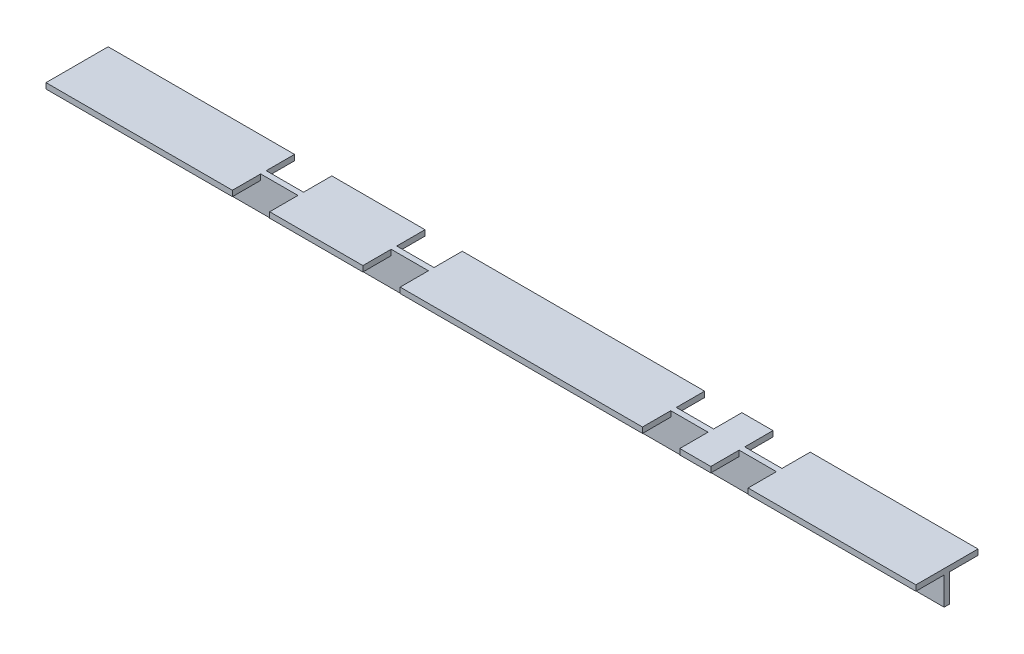
ISO-10303-21;
HEADER;
FILE_DESCRIPTION(('STEP AP214'),'2;1');
FILE_NAME('part.step','',(''),(''),'','','');
FILE_SCHEMA(('AUTOMOTIVE_DESIGN { 1 0 10303 214 1 1 1 1 }'));
ENDSEC;
DATA;
#1=APPLICATION_CONTEXT('core data for automotive mechanical design processes');
#2=APPLICATION_PROTOCOL_DEFINITION('international standard','automotive_design',2000,#1);
#3=PRODUCT_CONTEXT('',#1,'mechanical');
#4=PRODUCT('Part','Part','',(#3));
#5=PRODUCT_RELATED_PRODUCT_CATEGORY('part','',(#4));
#6=PRODUCT_DEFINITION_FORMATION('','',#4);
#7=PRODUCT_DEFINITION_CONTEXT('part definition',#1,'design');
#8=PRODUCT_DEFINITION('design','',#6,#7);
#9=PRODUCT_DEFINITION_SHAPE('','',#8);
#10=(LENGTH_UNIT() NAMED_UNIT(*) SI_UNIT(.MILLI.,.METRE.));
#11=(NAMED_UNIT(*) PLANE_ANGLE_UNIT() SI_UNIT($,.RADIAN.));
#12=(NAMED_UNIT(*) SI_UNIT($,.STERADIAN.) SOLID_ANGLE_UNIT());
#13=UNCERTAINTY_MEASURE_WITH_UNIT(LENGTH_MEASURE(1.E-05),#10,'distance_accuracy_value','');
#14=(GEOMETRIC_REPRESENTATION_CONTEXT(3) GLOBAL_UNCERTAINTY_ASSIGNED_CONTEXT((#13)) GLOBAL_UNIT_ASSIGNED_CONTEXT((#10,
#11,#12)) REPRESENTATION_CONTEXT('',''));
#15=CARTESIAN_POINT('',(0.,0.,0.));
#16=DIRECTION('',(0.,0.,1.));
#17=DIRECTION('',(1.,0.,0.));
#18=AXIS2_PLACEMENT_3D('',#15,#16,#17);
#19=CARTESIAN_POINT('',(1400.,0.,0.));
#20=DIRECTION('',(0.,0.,-1.));
#21=DIRECTION('',(-1.,0.,0.));
#22=AXIS2_PLACEMENT_3D('',#19,#20,#21);
#23=PLANE('',#22);
#24=DIRECTION('',(-1.,0.,0.));
#25=VECTOR('',#24,1.);
#26=CARTESIAN_POINT('',(1400.,0.,0.));
#27=LINE('',#26,#25);
#28=CARTESIAN_POINT('',(960.,0.,0.));
#29=VERTEX_POINT('',#28);
#30=CARTESIAN_POINT('',(570.,0.,0.));
#31=VERTEX_POINT('',#30);
#32=EDGE_CURVE('E686',#29,#31,#27,.T.);
#33=ORIENTED_EDGE('',*,*,#32,.T.);
#34=DIRECTION('',(0.,-1.,0.));
#35=VECTOR('',#34,1.);
#36=CARTESIAN_POINT('',(570.,0.,0.));
#37=LINE('',#36,#35);
#38=CARTESIAN_POINT('',(570.,-9.,0.));
#39=VERTEX_POINT('',#38);
#40=EDGE_CURVE('E422',#31,#39,#37,.T.);
#41=ORIENTED_EDGE('',*,*,#40,.T.);
#42=DIRECTION('',(-1.,0.,0.));
#43=VECTOR('',#42,1.);
#44=CARTESIAN_POINT('',(1400.,-9.,0.));
#45=LINE('',#44,#43);
#46=CARTESIAN_POINT('',(960.,-9.,0.));
#47=VERTEX_POINT('',#46);
#48=EDGE_CURVE('E679',#47,#39,#45,.T.);
#49=ORIENTED_EDGE('',*,*,#48,.F.);
#50=DIRECTION('',(0.,-1.,0.));
#51=VECTOR('',#50,1.);
#52=CARTESIAN_POINT('',(960.,0.,0.));
#53=LINE('',#52,#51);
#54=EDGE_CURVE('E405',#29,#47,#53,.T.);
#55=ORIENTED_EDGE('',*,*,#54,.F.);
#56=EDGE_LOOP('',(#33,#41,#49,#55));
#57=FACE_BOUND('',#56,.T.);
#58=ADVANCED_FACE('F40',(#57),#23,.F.);
#59=CARTESIAN_POINT('',(1400.,0.,0.));
#60=VERTEX_POINT('',#59);
#61=CARTESIAN_POINT('',(1130.,0.,0.));
#62=VERTEX_POINT('',#61);
#63=EDGE_CURVE('E620',#60,#62,#27,.T.);
#64=ORIENTED_EDGE('',*,*,#63,.T.);
#65=DIRECTION('',(0.,-1.,0.));
#66=VECTOR('',#65,1.);
#67=CARTESIAN_POINT('',(1130.,0.,0.));
#68=LINE('',#67,#66);
#69=CARTESIAN_POINT('',(1130.,-9.,0.));
#70=VERTEX_POINT('',#69);
#71=EDGE_CURVE('E454',#62,#70,#68,.T.);
#72=ORIENTED_EDGE('',*,*,#71,.T.);
#73=CARTESIAN_POINT('',(1400.,-9.,0.));
#74=VERTEX_POINT('',#73);
#75=EDGE_CURVE('E11',#74,#70,#45,.T.);
#76=ORIENTED_EDGE('',*,*,#75,.F.);
#77=DIRECTION('',(0.,-1.,0.));
#78=VECTOR('',#77,1.);
#79=CARTESIAN_POINT('',(1400.,0.,0.));
#80=LINE('',#79,#78);
#81=EDGE_CURVE('E566',#60,#74,#80,.T.);
#82=ORIENTED_EDGE('',*,*,#81,.F.);
#83=EDGE_LOOP('',(#64,#72,#76,#82));
#84=FACE_BOUND('',#83,.T.);
#85=ADVANCED_FACE('F757',(#84),#23,.F.);
#86=CARTESIAN_POINT('',(1070.,-9.,0.));
#87=VERTEX_POINT('',#86);
#88=CARTESIAN_POINT('',(1020.,-9.,0.));
#89=VERTEX_POINT('',#88);
#90=EDGE_CURVE('E49',#87,#89,#45,.T.);
#91=ORIENTED_EDGE('',*,*,#90,.F.);
#92=DIRECTION('',(0.,-1.,0.));
#93=VECTOR('',#92,1.);
#94=CARTESIAN_POINT('',(1070.,0.,0.));
#95=LINE('',#94,#93);
#96=CARTESIAN_POINT('',(1070.,0.,0.));
#97=VERTEX_POINT('',#96);
#98=EDGE_CURVE('E467',#97,#87,#95,.T.);
#99=ORIENTED_EDGE('',*,*,#98,.F.);
#100=CARTESIAN_POINT('',(1020.,0.,0.));
#101=VERTEX_POINT('',#100);
#102=EDGE_CURVE('E625',#97,#101,#27,.T.);
#103=ORIENTED_EDGE('',*,*,#102,.T.);
#104=DIRECTION('',(0.,-1.,0.));
#105=VECTOR('',#104,1.);
#106=CARTESIAN_POINT('',(1020.,0.,0.));
#107=LINE('',#106,#105);
#108=EDGE_CURVE('E394',#101,#89,#107,.T.);
#109=ORIENTED_EDGE('',*,*,#108,.T.);
#110=EDGE_LOOP('',(#91,#99,#103,#109));
#111=FACE_BOUND('',#110,.T.);
#112=ADVANCED_FACE('F738',(#111),#23,.F.);
#113=CARTESIAN_POINT('',(510.,-9.,0.));
#114=VERTEX_POINT('',#113);
#115=CARTESIAN_POINT('',(360.,-9.,0.));
#116=VERTEX_POINT('',#115);
#117=EDGE_CURVE('E658',#114,#116,#45,.T.);
#118=ORIENTED_EDGE('',*,*,#117,.F.);
#119=DIRECTION('',(0.,-1.,0.));
#120=VECTOR('',#119,1.);
#121=CARTESIAN_POINT('',(510.,0.,0.));
#122=LINE('',#121,#120);
#123=CARTESIAN_POINT('',(510.,0.,0.));
#124=VERTEX_POINT('',#123);
#125=EDGE_CURVE('E437',#124,#114,#122,.T.);
#126=ORIENTED_EDGE('',*,*,#125,.F.);
#127=CARTESIAN_POINT('',(360.,0.,0.));
#128=VERTEX_POINT('',#127);
#129=EDGE_CURVE('E688',#124,#128,#27,.T.);
#130=ORIENTED_EDGE('',*,*,#129,.T.);
#131=DIRECTION('',(0.,-1.,0.));
#132=VECTOR('',#131,1.);
#133=CARTESIAN_POINT('',(360.,0.,0.));
#134=LINE('',#133,#132);
#135=EDGE_CURVE('E547',#128,#116,#134,.T.);
#136=ORIENTED_EDGE('',*,*,#135,.T.);
#137=EDGE_LOOP('',(#118,#126,#130,#136));
#138=FACE_BOUND('',#137,.T.);
#139=ADVANCED_FACE('F722',(#138),#23,.F.);
#140=CARTESIAN_POINT('',(1400.,-9.,0.));
#141=DIRECTION('',(0.,1.,0.));
#142=DIRECTION('',(0.,0.,1.));
#143=AXIS2_PLACEMENT_3D('',#140,#141,#142);
#144=PLANE('',#143);
#145=ORIENTED_EDGE('',*,*,#48,.T.);
#146=DIRECTION('',(0.,0.,1.));
#147=VECTOR('',#146,1.);
#148=CARTESIAN_POINT('',(570.,-8.99999999999998,-45.5));
#149=LINE('',#148,#147);
#150=CARTESIAN_POINT('',(570.,-8.99999999999998,-45.5));
#151=VERTEX_POINT('',#150);
#152=EDGE_CURVE('E423',#151,#39,#149,.T.);
#153=ORIENTED_EDGE('',*,*,#152,.F.);
#154=DIRECTION('',(-1.,0.,0.));
#155=VECTOR('',#154,1.);
#156=CARTESIAN_POINT('',(1400.,-8.99999999999998,-45.5));
#157=LINE('',#156,#155);
#158=CARTESIAN_POINT('',(960.,-8.99999999999998,-45.5));
#159=VERTEX_POINT('',#158);
#160=EDGE_CURVE('E660',#159,#151,#157,.T.);
#161=ORIENTED_EDGE('',*,*,#160,.F.);
#162=DIRECTION('',(0.,0.,-1.));
#163=VECTOR('',#162,1.);
#164=CARTESIAN_POINT('',(960.,-9.,0.));
#165=LINE('',#164,#163);
#166=EDGE_CURVE('E386',#47,#159,#165,.T.);
#167=ORIENTED_EDGE('',*,*,#166,.F.);
#168=EDGE_LOOP('',(#145,#153,#161,#167));
#169=FACE_BOUND('',#168,.T.);
#170=ADVANCED_FACE('F677',(#169),#144,.F.);
#171=ORIENTED_EDGE('',*,*,#75,.T.);
#172=DIRECTION('',(0.,0.,1.));
#173=VECTOR('',#172,1.);
#174=CARTESIAN_POINT('',(1130.,-8.99999999999998,-45.5));
#175=LINE('',#174,#173);
#176=CARTESIAN_POINT('',(1130.,-8.99999999999998,-45.5));
#177=VERTEX_POINT('',#176);
#178=EDGE_CURVE('E455',#177,#70,#175,.T.);
#179=ORIENTED_EDGE('',*,*,#178,.F.);
#180=CARTESIAN_POINT('',(1400.,-8.99999999999998,-45.5));
#181=VERTEX_POINT('',#180);
#182=EDGE_CURVE('E650',#181,#177,#157,.T.);
#183=ORIENTED_EDGE('',*,*,#182,.F.);
#184=DIRECTION('',(0.,0.,-1.));
#185=VECTOR('',#184,1.);
#186=CARTESIAN_POINT('',(1400.,-9.,0.));
#187=LINE('',#186,#185);
#188=EDGE_CURVE('E570',#74,#181,#187,.T.);
#189=ORIENTED_EDGE('',*,*,#188,.F.);
#190=EDGE_LOOP('',(#171,#179,#183,#189));
#191=FACE_BOUND('',#190,.T.);
#192=ADVANCED_FACE('F778',(#191),#144,.F.);
#193=CARTESIAN_POINT('',(1070.,-8.99999999999998,-45.5));
#194=VERTEX_POINT('',#193);
#195=CARTESIAN_POINT('',(1020.,-8.99999999999998,-45.5));
#196=VERTEX_POINT('',#195);
#197=EDGE_CURVE('E653',#194,#196,#157,.T.);
#198=ORIENTED_EDGE('',*,*,#197,.F.);
#199=DIRECTION('',(0.,0.,-1.));
#200=VECTOR('',#199,1.);
#201=CARTESIAN_POINT('',(1070.,-8.99999999999998,-45.5));
#202=LINE('',#201,#200);
#203=EDGE_CURVE('E448',#87,#194,#202,.T.);
#204=ORIENTED_EDGE('',*,*,#203,.F.);
#205=ORIENTED_EDGE('',*,*,#90,.T.);
#206=DIRECTION('',(0.,0.,1.));
#207=VECTOR('',#206,1.);
#208=CARTESIAN_POINT('',(1020.,-9.,0.));
#209=LINE('',#208,#207);
#210=EDGE_CURVE('E340',#196,#89,#209,.T.);
#211=ORIENTED_EDGE('',*,*,#210,.F.);
#212=EDGE_LOOP('',(#198,#204,#205,#211));
#213=FACE_BOUND('',#212,.T.);
#214=ADVANCED_FACE('F735',(#213),#144,.F.);
#215=CARTESIAN_POINT('',(510.,-8.99999999999998,-45.5));
#216=VERTEX_POINT('',#215);
#217=CARTESIAN_POINT('',(360.,-8.99999999999998,-45.5));
#218=VERTEX_POINT('',#217);
#219=EDGE_CURVE('E662',#216,#218,#157,.T.);
#220=ORIENTED_EDGE('',*,*,#219,.F.);
#221=DIRECTION('',(0.,0.,-1.));
#222=VECTOR('',#221,1.);
#223=CARTESIAN_POINT('',(510.,-8.99999999999998,-45.5));
#224=LINE('',#223,#222);
#225=EDGE_CURVE('E416',#114,#216,#224,.T.);
#226=ORIENTED_EDGE('',*,*,#225,.F.);
#227=ORIENTED_EDGE('',*,*,#117,.T.);
#228=DIRECTION('',(0.,0.,1.));
#229=VECTOR('',#228,1.);
#230=CARTESIAN_POINT('',(360.,-8.99999999999998,-45.5));
#231=LINE('',#230,#229);
#232=EDGE_CURVE('E433',#218,#116,#231,.T.);
#233=ORIENTED_EDGE('',*,*,#232,.F.);
#234=EDGE_LOOP('',(#220,#226,#227,#233));
#235=FACE_BOUND('',#234,.T.);
#236=ADVANCED_FACE('F725',(#235),#144,.F.);
#237=CARTESIAN_POINT('',(1400.,-8.99999999999998,-54.5));
#238=DIRECTION('',(0.,1.,0.));
#239=DIRECTION('',(0.,0.,1.));
#240=AXIS2_PLACEMENT_3D('',#237,#238,#239);
#241=PLANE('',#240);
#242=DIRECTION('',(-1.,0.,0.));
#243=VECTOR('',#242,1.);
#244=CARTESIAN_POINT('',(1400.,-8.99999999999998,-54.5));
#245=LINE('',#244,#243);
#246=CARTESIAN_POINT('',(1400.,-8.99999999999998,-54.5));
#247=VERTEX_POINT('',#246);
#248=CARTESIAN_POINT('',(1130.,-8.99999999999998,-54.5000000000001));
#249=VERTEX_POINT('',#248);
#250=EDGE_CURVE('E637',#247,#249,#245,.T.);
#251=ORIENTED_EDGE('',*,*,#250,.T.);
#252=DIRECTION('',(0.,0.,1.));
#253=VECTOR('',#252,1.);
#254=CARTESIAN_POINT('',(1130.,-8.99999999999996,-100.));
#255=LINE('',#254,#253);
#256=CARTESIAN_POINT('',(1130.,-8.99999999999996,-100.));
#257=VERTEX_POINT('',#256);
#258=EDGE_CURVE('E486',#257,#249,#255,.T.);
#259=ORIENTED_EDGE('',*,*,#258,.F.);
#260=DIRECTION('',(-1.,0.,0.));
#261=VECTOR('',#260,1.);
#262=CARTESIAN_POINT('',(1400.,-8.99999999999998,-100.));
#263=LINE('',#262,#261);
#264=CARTESIAN_POINT('',(1400.,-8.99999999999998,-100.));
#265=VERTEX_POINT('',#264);
#266=EDGE_CURVE('E631',#265,#257,#263,.T.);
#267=ORIENTED_EDGE('',*,*,#266,.F.);
#268=DIRECTION('',(0.,0.,-1.));
#269=VECTOR('',#268,1.);
#270=CARTESIAN_POINT('',(1400.,-8.99999999999998,-54.5));
#271=LINE('',#270,#269);
#272=EDGE_CURVE('E583',#247,#265,#271,.T.);
#273=ORIENTED_EDGE('',*,*,#272,.F.);
#274=EDGE_LOOP('',(#251,#259,#267,#273));
#275=FACE_BOUND('',#274,.T.);
#276=ADVANCED_FACE('F985',(#275),#241,.F.);
#277=CARTESIAN_POINT('',(960.,-8.99999999999998,-54.5000000000002));
#278=VERTEX_POINT('',#277);
#279=CARTESIAN_POINT('',(570.,-8.99999999999998,-54.5000000000004));
#280=VERTEX_POINT('',#279);
#281=EDGE_CURVE('E1009',#278,#280,#245,.T.);
#282=ORIENTED_EDGE('',*,*,#281,.T.);
#283=DIRECTION('',(0.,0.,1.));
#284=VECTOR('',#283,1.);
#285=CARTESIAN_POINT('',(570.,-8.99999999999996,-100.));
#286=LINE('',#285,#284);
#287=CARTESIAN_POINT('',(570.,-8.99999999999996,-100.));
#288=VERTEX_POINT('',#287);
#289=EDGE_CURVE('E371',#288,#280,#286,.T.);
#290=ORIENTED_EDGE('',*,*,#289,.F.);
#291=CARTESIAN_POINT('',(960.,-8.99999999999996,-100.));
#292=VERTEX_POINT('',#291);
#293=EDGE_CURVE('E1071',#292,#288,#263,.T.);
#294=ORIENTED_EDGE('',*,*,#293,.F.);
#295=DIRECTION('',(0.,0.,-1.));
#296=VECTOR('',#295,1.);
#297=CARTESIAN_POINT('',(960.,-8.99999999999998,-54.5000000000002));
#298=LINE('',#297,#296);
#299=EDGE_CURVE('E328',#278,#292,#298,.T.);
#300=ORIENTED_EDGE('',*,*,#299,.F.);
#301=EDGE_LOOP('',(#282,#290,#294,#300));
#302=FACE_BOUND('',#301,.T.);
#303=ADVANCED_FACE('F1052',(#302),#241,.F.);
#304=CARTESIAN_POINT('',(1070.,-8.99999999999996,-100.));
#305=VERTEX_POINT('',#304);
#306=CARTESIAN_POINT('',(1020.,-8.99999999999996,-100.));
#307=VERTEX_POINT('',#306);
#308=EDGE_CURVE('E636',#305,#307,#263,.T.);
#309=ORIENTED_EDGE('',*,*,#308,.F.);
#310=DIRECTION('',(0.,0.,-1.));
#311=VECTOR('',#310,1.);
#312=CARTESIAN_POINT('',(1070.,-8.99999999999996,-100.));
#313=LINE('',#312,#311);
#314=CARTESIAN_POINT('',(1070.,-8.99999999999998,-54.5));
#315=VERTEX_POINT('',#314);
#316=EDGE_CURVE('E478',#315,#305,#313,.T.);
#317=ORIENTED_EDGE('',*,*,#316,.F.);
#318=CARTESIAN_POINT('',(1020.,-8.99999999999998,-54.5));
#319=VERTEX_POINT('',#318);
#320=EDGE_CURVE('E642',#315,#319,#245,.T.);
#321=ORIENTED_EDGE('',*,*,#320,.T.);
#322=DIRECTION('',(0.,0.,1.));
#323=VECTOR('',#322,1.);
#324=CARTESIAN_POINT('',(1020.,-8.99999999999998,-54.5));
#325=LINE('',#324,#323);
#326=EDGE_CURVE('E304',#307,#319,#325,.T.);
#327=ORIENTED_EDGE('',*,*,#326,.F.);
#328=EDGE_LOOP('',(#309,#317,#321,#327));
#329=FACE_BOUND('',#328,.T.);
#330=ADVANCED_FACE('F1023',(#329),#241,.F.);
#331=CARTESIAN_POINT('',(510.,-8.99999999999996,-100.));
#332=VERTEX_POINT('',#331);
#333=CARTESIAN_POINT('',(360.,-8.99999999999996,-100.));
#334=VERTEX_POINT('',#333);
#335=EDGE_CURVE('E1068',#332,#334,#263,.T.);
#336=ORIENTED_EDGE('',*,*,#335,.F.);
#337=DIRECTION('',(0.,0.,-1.));
#338=VECTOR('',#337,1.);
#339=CARTESIAN_POINT('',(510.,-8.99999999999996,-100.));
#340=LINE('',#339,#338);
#341=CARTESIAN_POINT('',(510.,-8.99999999999998,-54.5));
#342=VERTEX_POINT('',#341);
#343=EDGE_CURVE('E509',#342,#332,#340,.T.);
#344=ORIENTED_EDGE('',*,*,#343,.F.);
#345=CARTESIAN_POINT('',(360.,-8.99999999999998,-54.5000000000005));
#346=VERTEX_POINT('',#345);
#347=EDGE_CURVE('E1006',#342,#346,#245,.T.);
#348=ORIENTED_EDGE('',*,*,#347,.T.);
#349=DIRECTION('',(0.,0.,1.));
#350=VECTOR('',#349,1.);
#351=CARTESIAN_POINT('',(360.,-8.99999999999996,-100.));
#352=LINE('',#351,#350);
#353=EDGE_CURVE('E361',#334,#346,#352,.T.);
#354=ORIENTED_EDGE('',*,*,#353,.F.);
#355=EDGE_LOOP('',(#336,#344,#348,#354));
#356=FACE_BOUND('',#355,.T.);
#357=ADVANCED_FACE('F986',(#356),#241,.F.);
#358=CARTESIAN_POINT('',(1400.,0.,-100.));
#359=DIRECTION('',(0.,0.,1.));
#360=DIRECTION('',(1.,0.,0.));
#361=AXIS2_PLACEMENT_3D('',#358,#359,#360);
#362=PLANE('',#361);
#363=ORIENTED_EDGE('',*,*,#266,.T.);
#364=DIRECTION('',(0.,-1.,0.));
#365=VECTOR('',#364,1.);
#366=CARTESIAN_POINT('',(1130.,0.,-100.));
#367=LINE('',#366,#365);
#368=CARTESIAN_POINT('',(1130.,0.,-100.));
#369=VERTEX_POINT('',#368);
#370=EDGE_CURVE('E458',#369,#257,#367,.T.);
#371=ORIENTED_EDGE('',*,*,#370,.F.);
#372=DIRECTION('',(-1.,0.,0.));
#373=VECTOR('',#372,1.);
#374=CARTESIAN_POINT('',(1400.,0.,-100.));
#375=LINE('',#374,#373);
#376=CARTESIAN_POINT('',(1400.,0.,-100.));
#377=VERTEX_POINT('',#376);
#378=EDGE_CURVE('E626',#377,#369,#375,.T.);
#379=ORIENTED_EDGE('',*,*,#378,.F.);
#380=DIRECTION('',(0.,1.,0.));
#381=VECTOR('',#380,1.);
#382=CARTESIAN_POINT('',(1400.,0.,-100.));
#383=LINE('',#382,#381);
#384=EDGE_CURVE('E586',#265,#377,#383,.T.);
#385=ORIENTED_EDGE('',*,*,#384,.F.);
#386=EDGE_LOOP('',(#363,#371,#379,#385));
#387=FACE_BOUND('',#386,.T.);
#388=ADVANCED_FACE('F983',(#387),#362,.F.);
#389=ORIENTED_EDGE('',*,*,#293,.T.);
#390=DIRECTION('',(0.,-1.,0.));
#391=VECTOR('',#390,1.);
#392=CARTESIAN_POINT('',(570.,0.,-100.));
#393=LINE('',#392,#391);
#394=CARTESIAN_POINT('',(570.,0.,-100.));
#395=VERTEX_POINT('',#394);
#396=EDGE_CURVE('E490',#395,#288,#393,.T.);
#397=ORIENTED_EDGE('',*,*,#396,.F.);
#398=CARTESIAN_POINT('',(960.,0.,-100.));
#399=VERTEX_POINT('',#398);
#400=EDGE_CURVE('E1081',#399,#395,#375,.T.);
#401=ORIENTED_EDGE('',*,*,#400,.F.);
#402=DIRECTION('',(0.,-1.,0.));
#403=VECTOR('',#402,1.);
#404=CARTESIAN_POINT('',(960.,0.,-100.));
#405=LINE('',#404,#403);
#406=EDGE_CURVE('E341',#399,#292,#405,.T.);
#407=ORIENTED_EDGE('',*,*,#406,.T.);
#408=EDGE_LOOP('',(#389,#397,#401,#407));
#409=FACE_BOUND('',#408,.T.);
#410=ADVANCED_FACE('F1065',(#409),#362,.F.);
#411=CARTESIAN_POINT('',(1070.,0.,-100.));
#412=VERTEX_POINT('',#411);
#413=CARTESIAN_POINT('',(1020.,0.,-100.));
#414=VERTEX_POINT('',#413);
#415=EDGE_CURVE('E326',#412,#414,#375,.T.);
#416=ORIENTED_EDGE('',*,*,#415,.F.);
#417=DIRECTION('',(0.,-1.,0.));
#418=VECTOR('',#417,1.);
#419=CARTESIAN_POINT('',(1070.,0.,-100.));
#420=LINE('',#419,#418);
#421=EDGE_CURVE('E495',#412,#305,#420,.T.);
#422=ORIENTED_EDGE('',*,*,#421,.T.);
#423=ORIENTED_EDGE('',*,*,#308,.T.);
#424=DIRECTION('',(0.,-1.,0.));
#425=VECTOR('',#424,1.);
#426=CARTESIAN_POINT('',(1020.,0.,-100.));
#427=LINE('',#426,#425);
#428=EDGE_CURVE('E337',#414,#307,#427,.T.);
#429=ORIENTED_EDGE('',*,*,#428,.F.);
#430=EDGE_LOOP('',(#416,#422,#423,#429));
#431=FACE_BOUND('',#430,.T.);
#432=ADVANCED_FACE('F769',(#431),#362,.F.);
#433=CARTESIAN_POINT('',(510.,0.,-100.));
#434=VERTEX_POINT('',#433);
#435=CARTESIAN_POINT('',(360.,0.,-100.));
#436=VERTEX_POINT('',#435);
#437=EDGE_CURVE('E1079',#434,#436,#375,.T.);
#438=ORIENTED_EDGE('',*,*,#437,.F.);
#439=DIRECTION('',(0.,-1.,0.));
#440=VECTOR('',#439,1.);
#441=CARTESIAN_POINT('',(510.,0.,-100.));
#442=LINE('',#441,#440);
#443=EDGE_CURVE('E525',#434,#332,#442,.T.);
#444=ORIENTED_EDGE('',*,*,#443,.T.);
#445=ORIENTED_EDGE('',*,*,#335,.T.);
#446=DIRECTION('',(0.,-1.,0.));
#447=VECTOR('',#446,1.);
#448=CARTESIAN_POINT('',(360.,0.,-100.));
#449=LINE('',#448,#447);
#450=EDGE_CURVE('E368',#436,#334,#449,.T.);
#451=ORIENTED_EDGE('',*,*,#450,.F.);
#452=EDGE_LOOP('',(#438,#444,#445,#451));
#453=FACE_BOUND('',#452,.T.);
#454=ADVANCED_FACE('F764',(#453),#362,.F.);
#455=CARTESIAN_POINT('',(300.,-9.,0.));
#456=VERTEX_POINT('',#455);
#457=CARTESIAN_POINT('',(0.,-9.,0.));
#458=VERTEX_POINT('',#457);
#459=EDGE_CURVE('E50',#456,#458,#45,.T.);
#460=ORIENTED_EDGE('',*,*,#459,.F.);
#461=DIRECTION('',(0.,-1.,0.));
#462=VECTOR('',#461,1.);
#463=CARTESIAN_POINT('',(300.,0.,0.));
#464=LINE('',#463,#462);
#465=CARTESIAN_POINT('',(300.,0.,0.));
#466=VERTEX_POINT('',#465);
#467=EDGE_CURVE('E560',#466,#456,#464,.T.);
#468=ORIENTED_EDGE('',*,*,#467,.F.);
#469=CARTESIAN_POINT('',(0.,0.,0.));
#470=VERTEX_POINT('',#469);
#471=EDGE_CURVE('E592',#466,#470,#27,.T.);
#472=ORIENTED_EDGE('',*,*,#471,.T.);
#473=DIRECTION('',(0.,-1.,0.));
#474=VECTOR('',#473,1.);
#475=CARTESIAN_POINT('',(0.,0.,0.));
#476=LINE('',#475,#474);
#477=EDGE_CURVE('E556',#470,#458,#476,.T.);
#478=ORIENTED_EDGE('',*,*,#477,.T.);
#479=EDGE_LOOP('',(#460,#468,#472,#478));
#480=FACE_BOUND('',#479,.T.);
#481=ADVANCED_FACE('F42',(#480),#23,.F.);
#482=CARTESIAN_POINT('',(300.,-8.99999999999998,-45.5));
#483=VERTEX_POINT('',#482);
#484=CARTESIAN_POINT('',(0.,-8.99999999999998,-45.5));
#485=VERTEX_POINT('',#484);
#486=EDGE_CURVE('E649',#483,#485,#157,.T.);
#487=ORIENTED_EDGE('',*,*,#486,.F.);
#488=DIRECTION('',(0.,0.,-1.));
#489=VECTOR('',#488,1.);
#490=CARTESIAN_POINT('',(300.,-8.99999999999998,-45.5));
#491=LINE('',#490,#489);
#492=EDGE_CURVE('E539',#456,#483,#491,.T.);
#493=ORIENTED_EDGE('',*,*,#492,.F.);
#494=ORIENTED_EDGE('',*,*,#459,.T.);
#495=DIRECTION('',(0.,0.,-1.));
#496=VECTOR('',#495,1.);
#497=CARTESIAN_POINT('',(0.,-9.,0.));
#498=LINE('',#497,#496);
#499=EDGE_CURVE('E596',#458,#485,#498,.T.);
#500=ORIENTED_EDGE('',*,*,#499,.T.);
#501=EDGE_LOOP('',(#487,#493,#494,#500));
#502=FACE_BOUND('',#501,.T.);
#503=ADVANCED_FACE('F711',(#502),#144,.F.);
#504=CARTESIAN_POINT('',(1400.,-8.99999999999998,-45.5));
#505=DIRECTION('',(0.,0.,-1.));
#506=DIRECTION('',(-1.,0.,0.));
#507=AXIS2_PLACEMENT_3D('',#504,#505,#506);
#508=PLANE('',#507);
#509=DIRECTION('',(0.,-1.,0.));
#510=VECTOR('',#509,1.);
#511=CARTESIAN_POINT('',(0.,-8.99999999999998,-45.5));
#512=LINE('',#511,#510);
#513=CARTESIAN_POINT('',(0.,-54.,-45.5));
#514=VERTEX_POINT('',#513);
#515=EDGE_CURVE('E600',#485,#514,#512,.T.);
#516=ORIENTED_EDGE('',*,*,#515,.T.);
#517=DIRECTION('',(-1.,0.,0.));
#518=VECTOR('',#517,1.);
#519=CARTESIAN_POINT('',(1400.,-54.,-45.5));
#520=LINE('',#519,#518);
#521=CARTESIAN_POINT('',(1400.,-54.,-45.5));
#522=VERTEX_POINT('',#521);
#523=EDGE_CURVE('E646',#522,#514,#520,.T.);
#524=ORIENTED_EDGE('',*,*,#523,.F.);
#525=DIRECTION('',(0.,-1.,0.));
#526=VECTOR('',#525,1.);
#527=CARTESIAN_POINT('',(1400.,-8.99999999999998,-45.5));
#528=LINE('',#527,#526);
#529=EDGE_CURVE('E574',#181,#522,#528,.T.);
#530=ORIENTED_EDGE('',*,*,#529,.F.);
#531=ORIENTED_EDGE('',*,*,#182,.T.);
#532=DIRECTION('',(0.,-1.,0.));
#533=VECTOR('',#532,1.);
#534=CARTESIAN_POINT('',(1130.,0.,-45.5));
#535=LINE('',#534,#533);
#536=CARTESIAN_POINT('',(1130.,0.,-45.5));
#537=VERTEX_POINT('',#536);
#538=EDGE_CURVE('E426',#537,#177,#535,.T.);
#539=ORIENTED_EDGE('',*,*,#538,.F.);
#540=DIRECTION('',(1.,0.,0.));
#541=VECTOR('',#540,1.);
#542=CARTESIAN_POINT('',(1130.,0.,-45.5));
#543=LINE('',#542,#541);
#544=CARTESIAN_POINT('',(1070.,0.,-45.5));
#545=VERTEX_POINT('',#544);
#546=EDGE_CURVE('E64',#545,#537,#543,.T.);
#547=ORIENTED_EDGE('',*,*,#546,.F.);
#548=DIRECTION('',(0.,-1.,0.));
#549=VECTOR('',#548,1.);
#550=CARTESIAN_POINT('',(1070.,0.,-45.5));
#551=LINE('',#550,#549);
#552=EDGE_CURVE('E464',#545,#194,#551,.T.);
#553=ORIENTED_EDGE('',*,*,#552,.T.);
#554=ORIENTED_EDGE('',*,*,#197,.T.);
#555=DIRECTION('',(0.,-1.,0.));
#556=VECTOR('',#555,1.);
#557=CARTESIAN_POINT('',(1020.,0.,-45.5));
#558=LINE('',#557,#556);
#559=CARTESIAN_POINT('',(1020.,0.,-45.5));
#560=VERTEX_POINT('',#559);
#561=EDGE_CURVE('E365',#560,#196,#558,.T.);
#562=ORIENTED_EDGE('',*,*,#561,.F.);
#563=DIRECTION('',(1.,0.,0.));
#564=VECTOR('',#563,1.);
#565=CARTESIAN_POINT('',(1020.,0.,-45.5));
#566=LINE('',#565,#564);
#567=CARTESIAN_POINT('',(960.,0.,-45.5));
#568=VERTEX_POINT('',#567);
#569=EDGE_CURVE('E390',#568,#560,#566,.T.);
#570=ORIENTED_EDGE('',*,*,#569,.F.);
#571=DIRECTION('',(0.,-1.,0.));
#572=VECTOR('',#571,1.);
#573=CARTESIAN_POINT('',(960.,0.,-45.5));
#574=LINE('',#573,#572);
#575=EDGE_CURVE('E402',#568,#159,#574,.T.);
#576=ORIENTED_EDGE('',*,*,#575,.T.);
#577=ORIENTED_EDGE('',*,*,#160,.T.);
#578=DIRECTION('',(0.,-1.,0.));
#579=VECTOR('',#578,1.);
#580=CARTESIAN_POINT('',(570.,0.,-45.5));
#581=LINE('',#580,#579);
#582=CARTESIAN_POINT('',(570.,0.,-45.5));
#583=VERTEX_POINT('',#582);
#584=EDGE_CURVE('E430',#583,#151,#581,.T.);
#585=ORIENTED_EDGE('',*,*,#584,.F.);
#586=DIRECTION('',(1.,0.,0.));
#587=VECTOR('',#586,1.);
#588=CARTESIAN_POINT('',(570.,0.,-45.5));
#589=LINE('',#588,#587);
#590=CARTESIAN_POINT('',(510.,0.,-45.5));
#591=VERTEX_POINT('',#590);
#592=EDGE_CURVE('E57',#591,#583,#589,.T.);
#593=ORIENTED_EDGE('',*,*,#592,.F.);
#594=DIRECTION('',(0.,-1.,0.));
#595=VECTOR('',#594,1.);
#596=CARTESIAN_POINT('',(510.,0.,-45.5));
#597=LINE('',#596,#595);
#598=EDGE_CURVE('E434',#591,#216,#597,.T.);
#599=ORIENTED_EDGE('',*,*,#598,.T.);
#600=ORIENTED_EDGE('',*,*,#219,.T.);
#601=DIRECTION('',(0.,-1.,0.));
#602=VECTOR('',#601,1.);
#603=CARTESIAN_POINT('',(360.,0.,-45.5));
#604=LINE('',#603,#602);
#605=CARTESIAN_POINT('',(360.,0.,-45.5));
#606=VERTEX_POINT('',#605);
#607=EDGE_CURVE('E553',#606,#218,#604,.T.);
#608=ORIENTED_EDGE('',*,*,#607,.F.);
#609=DIRECTION('',(1.,0.,0.));
#610=VECTOR('',#609,1.);
#611=CARTESIAN_POINT('',(360.,0.,-45.5));
#612=LINE('',#611,#610);
#613=CARTESIAN_POINT('',(300.,0.,-45.5));
#614=VERTEX_POINT('',#613);
#615=EDGE_CURVE('E543',#614,#606,#612,.T.);
#616=ORIENTED_EDGE('',*,*,#615,.F.);
#617=DIRECTION('',(0.,-1.,0.));
#618=VECTOR('',#617,1.);
#619=CARTESIAN_POINT('',(300.,0.,-45.5));
#620=LINE('',#619,#618);
#621=EDGE_CURVE('E557',#614,#483,#620,.T.);
#622=ORIENTED_EDGE('',*,*,#621,.T.);
#623=ORIENTED_EDGE('',*,*,#486,.T.);
#624=EDGE_LOOP('',(#516,#524,#530,#531,#539,#547,#553,#554,#562,#570,#576,#577,#585,#593,#599,
#600,#608,#616,#622,#623));
#625=FACE_BOUND('',#624,.T.);
#626=ADVANCED_FACE('F670',(#625),#508,.F.);
#627=CARTESIAN_POINT('',(1400.,-54.,-45.5));
#628=DIRECTION('',(0.,1.,0.));
#629=DIRECTION('',(0.,0.,1.));
#630=AXIS2_PLACEMENT_3D('',#627,#628,#629);
#631=PLANE('',#630);
#632=DIRECTION('',(0.,0.,-1.));
#633=VECTOR('',#632,1.);
#634=CARTESIAN_POINT('',(0.,-54.,-45.5));
#635=LINE('',#634,#633);
#636=CARTESIAN_POINT('',(0.,-54.,-54.5));
#637=VERTEX_POINT('',#636);
#638=EDGE_CURVE('E603',#514,#637,#635,.T.);
#639=ORIENTED_EDGE('',*,*,#638,.T.);
#640=DIRECTION('',(-1.,0.,0.));
#641=VECTOR('',#640,1.);
#642=CARTESIAN_POINT('',(1400.,-54.,-54.5));
#643=LINE('',#642,#641);
#644=CARTESIAN_POINT('',(1400.,-54.,-54.5));
#645=VERTEX_POINT('',#644);
#646=EDGE_CURVE('E641',#645,#637,#643,.T.);
#647=ORIENTED_EDGE('',*,*,#646,.F.);
#648=DIRECTION('',(0.,0.,-1.));
#649=VECTOR('',#648,1.);
#650=CARTESIAN_POINT('',(1400.,-54.,-45.5));
#651=LINE('',#650,#649);
#652=EDGE_CURVE('E577',#522,#645,#651,.T.);
#653=ORIENTED_EDGE('',*,*,#652,.F.);
#654=ORIENTED_EDGE('',*,*,#523,.T.);
#655=EDGE_LOOP('',(#639,#647,#653,#654));
#656=FACE_BOUND('',#655,.T.);
#657=ADVANCED_FACE('F802',(#656),#631,.F.);
#658=CARTESIAN_POINT('',(1400.,-8.99999999999998,-54.5));
#659=DIRECTION('',(0.,0.,1.));
#660=DIRECTION('',(0.,-1.,0.));
#661=AXIS2_PLACEMENT_3D('',#658,#659,#660);
#662=PLANE('',#661);
#663=DIRECTION('',(0.,1.,0.));
#664=VECTOR('',#663,1.);
#665=CARTESIAN_POINT('',(0.,-8.99999999999998,-54.5));
#666=LINE('',#665,#664);
#667=CARTESIAN_POINT('',(0.,-8.99999999999998,-54.5));
#668=VERTEX_POINT('',#667);
#669=EDGE_CURVE('E606',#637,#668,#666,.T.);
#670=ORIENTED_EDGE('',*,*,#669,.T.);
#671=CARTESIAN_POINT('',(300.,-8.99999999999998,-54.5));
#672=VERTEX_POINT('',#671);
#673=EDGE_CURVE('E635',#672,#668,#245,.T.);
#674=ORIENTED_EDGE('',*,*,#673,.F.);
#675=DIRECTION('',(0.,-1.,0.));
#676=VECTOR('',#675,1.);
#677=CARTESIAN_POINT('',(300.,0.,-54.5));
#678=LINE('',#677,#676);
#679=CARTESIAN_POINT('',(300.,0.,-54.5));
#680=VERTEX_POINT('',#679);
#681=EDGE_CURVE('E376',#680,#672,#678,.T.);
#682=ORIENTED_EDGE('',*,*,#681,.F.);
#683=DIRECTION('',(-1.,0.,0.));
#684=VECTOR('',#683,1.);
#685=CARTESIAN_POINT('',(360.,0.,-54.5000000000005));
#686=LINE('',#685,#684);
#687=CARTESIAN_POINT('',(360.,0.,-54.5000000000005));
#688=VERTEX_POINT('',#687);
#689=EDGE_CURVE('E351',#688,#680,#686,.T.);
#690=ORIENTED_EDGE('',*,*,#689,.F.);
#691=DIRECTION('',(0.,-1.,0.));
#692=VECTOR('',#691,1.);
#693=CARTESIAN_POINT('',(360.,0.,-54.5000000000005));
#694=LINE('',#693,#692);
#695=EDGE_CURVE('E360',#688,#346,#694,.T.);
#696=ORIENTED_EDGE('',*,*,#695,.T.);
#697=ORIENTED_EDGE('',*,*,#347,.F.);
#698=DIRECTION('',(0.,-1.,0.));
#699=VECTOR('',#698,1.);
#700=CARTESIAN_POINT('',(510.,0.,-54.5));
#701=LINE('',#700,#699);
#702=CARTESIAN_POINT('',(510.,0.,-54.5));
#703=VERTEX_POINT('',#702);
#704=EDGE_CURVE('E529',#703,#342,#701,.T.);
#705=ORIENTED_EDGE('',*,*,#704,.F.);
#706=DIRECTION('',(-1.,0.,0.));
#707=VECTOR('',#706,1.);
#708=CARTESIAN_POINT('',(570.,0.,-54.5000000000004));
#709=LINE('',#708,#707);
#710=CARTESIAN_POINT('',(570.,0.,-54.5000000000004));
#711=VERTEX_POINT('',#710);
#712=EDGE_CURVE('E508',#711,#703,#709,.T.);
#713=ORIENTED_EDGE('',*,*,#712,.F.);
#714=DIRECTION('',(0.,-1.,0.));
#715=VECTOR('',#714,1.);
#716=CARTESIAN_POINT('',(570.,0.,-54.5000000000004));
#717=LINE('',#716,#715);
#718=EDGE_CURVE('E517',#711,#280,#717,.T.);
#719=ORIENTED_EDGE('',*,*,#718,.T.);
#720=ORIENTED_EDGE('',*,*,#281,.F.);
#721=DIRECTION('',(0.,-1.,0.));
#722=VECTOR('',#721,1.);
#723=CARTESIAN_POINT('',(960.,0.,-54.5000000000002));
#724=LINE('',#723,#722);
#725=CARTESIAN_POINT('',(960.,0.,-54.5000000000002));
#726=VERTEX_POINT('',#725);
#727=EDGE_CURVE('E309',#726,#278,#724,.T.);
#728=ORIENTED_EDGE('',*,*,#727,.F.);
#729=DIRECTION('',(-1.,0.,0.));
#730=VECTOR('',#729,1.);
#731=CARTESIAN_POINT('',(1020.,0.,-54.5));
#732=LINE('',#731,#730);
#733=CARTESIAN_POINT('',(1020.,0.,-54.5));
#734=VERTEX_POINT('',#733);
#735=EDGE_CURVE('E314',#734,#726,#732,.T.);
#736=ORIENTED_EDGE('',*,*,#735,.F.);
#737=DIRECTION('',(0.,-1.,0.));
#738=VECTOR('',#737,1.);
#739=CARTESIAN_POINT('',(1020.,0.,-54.5));
#740=LINE('',#739,#738);
#741=EDGE_CURVE('E297',#734,#319,#740,.T.);
#742=ORIENTED_EDGE('',*,*,#741,.T.);
#743=ORIENTED_EDGE('',*,*,#320,.F.);
#744=DIRECTION('',(0.,-1.,0.));
#745=VECTOR('',#744,1.);
#746=CARTESIAN_POINT('',(1070.,0.,-54.5));
#747=LINE('',#746,#745);
#748=CARTESIAN_POINT('',(1070.,0.,-54.5));
#749=VERTEX_POINT('',#748);
#750=EDGE_CURVE('E499',#749,#315,#747,.T.);
#751=ORIENTED_EDGE('',*,*,#750,.F.);
#752=DIRECTION('',(-1.,0.,0.));
#753=VECTOR('',#752,1.);
#754=CARTESIAN_POINT('',(1130.,0.,-54.5000000000001));
#755=LINE('',#754,#753);
#756=CARTESIAN_POINT('',(1130.,0.,-54.5000000000001));
#757=VERTEX_POINT('',#756);
#758=EDGE_CURVE('E477',#757,#749,#755,.T.);
#759=ORIENTED_EDGE('',*,*,#758,.F.);
#760=DIRECTION('',(0.,-1.,0.));
#761=VECTOR('',#760,1.);
#762=CARTESIAN_POINT('',(1130.,0.,-54.5000000000001));
#763=LINE('',#762,#761);
#764=EDGE_CURVE('E485',#757,#249,#763,.T.);
#765=ORIENTED_EDGE('',*,*,#764,.T.);
#766=ORIENTED_EDGE('',*,*,#250,.F.);
#767=DIRECTION('',(0.,1.,0.));
#768=VECTOR('',#767,1.);
#769=CARTESIAN_POINT('',(1400.,-8.99999999999998,-54.5));
#770=LINE('',#769,#768);
#771=EDGE_CURVE('E580',#645,#247,#770,.T.);
#772=ORIENTED_EDGE('',*,*,#771,.F.);
#773=ORIENTED_EDGE('',*,*,#646,.T.);
#774=EDGE_LOOP('',(#670,#674,#682,#690,#696,#697,#705,#713,#719,#720,#728,#736,#742,#743,#751,
#759,#765,#766,#772,#773));
#775=FACE_BOUND('',#774,.T.);
#776=ADVANCED_FACE('F316',(#775),#662,.F.);
#777=CARTESIAN_POINT('',(300.,-8.99999999999996,-100.));
#778=VERTEX_POINT('',#777);
#779=CARTESIAN_POINT('',(0.,-8.99999999999998,-100.));
#780=VERTEX_POINT('',#779);
#781=EDGE_CURVE('E630',#778,#780,#263,.T.);
#782=ORIENTED_EDGE('',*,*,#781,.F.);
#783=DIRECTION('',(0.,0.,-1.));
#784=VECTOR('',#783,1.);
#785=CARTESIAN_POINT('',(300.,-8.99999999999996,-100.));
#786=LINE('',#785,#784);
#787=EDGE_CURVE('E352',#672,#778,#786,.T.);
#788=ORIENTED_EDGE('',*,*,#787,.F.);
#789=ORIENTED_EDGE('',*,*,#673,.T.);
#790=DIRECTION('',(0.,0.,-1.));
#791=VECTOR('',#790,1.);
#792=CARTESIAN_POINT('',(0.,-8.99999999999998,-54.5));
#793=LINE('',#792,#791);
#794=EDGE_CURVE('E609',#668,#780,#793,.T.);
#795=ORIENTED_EDGE('',*,*,#794,.T.);
#796=EDGE_LOOP('',(#782,#788,#789,#795));
#797=FACE_BOUND('',#796,.T.);
#798=ADVANCED_FACE('F825',(#797),#241,.F.);
#799=CARTESIAN_POINT('',(300.,0.,-100.));
#800=VERTEX_POINT('',#799);
#801=CARTESIAN_POINT('',(0.,0.,-100.));
#802=VERTEX_POINT('',#801);
#803=EDGE_CURVE('E624',#800,#802,#375,.T.);
#804=ORIENTED_EDGE('',*,*,#803,.F.);
#805=DIRECTION('',(0.,-1.,0.));
#806=VECTOR('',#805,1.);
#807=CARTESIAN_POINT('',(300.,0.,-100.));
#808=LINE('',#807,#806);
#809=EDGE_CURVE('E372',#800,#778,#808,.T.);
#810=ORIENTED_EDGE('',*,*,#809,.T.);
#811=ORIENTED_EDGE('',*,*,#781,.T.);
#812=DIRECTION('',(0.,1.,0.));
#813=VECTOR('',#812,1.);
#814=CARTESIAN_POINT('',(0.,0.,-100.));
#815=LINE('',#814,#813);
#816=EDGE_CURVE('E613',#780,#802,#815,.T.);
#817=ORIENTED_EDGE('',*,*,#816,.T.);
#818=EDGE_LOOP('',(#804,#810,#811,#817));
#819=FACE_BOUND('',#818,.T.);
#820=ADVANCED_FACE('F772',(#819),#362,.F.);
#821=CARTESIAN_POINT('',(1400.,0.,0.));
#822=DIRECTION('',(0.,-1.,0.));
#823=DIRECTION('',(0.,0.,-1.));
#824=AXIS2_PLACEMENT_3D('',#821,#822,#823);
#825=PLANE('',#824);
#826=ORIENTED_EDGE('',*,*,#592,.T.);
#827=DIRECTION('',(0.,0.,1.));
#828=VECTOR('',#827,1.);
#829=CARTESIAN_POINT('',(570.,0.,-45.5));
#830=LINE('',#829,#828);
#831=EDGE_CURVE('E411',#583,#31,#830,.T.);
#832=ORIENTED_EDGE('',*,*,#831,.T.);
#833=ORIENTED_EDGE('',*,*,#32,.F.);
#834=DIRECTION('',(0.,0.,-1.));
#835=VECTOR('',#834,1.);
#836=CARTESIAN_POINT('',(960.,0.,0.));
#837=LINE('',#836,#835);
#838=EDGE_CURVE('E385',#29,#568,#837,.T.);
#839=ORIENTED_EDGE('',*,*,#838,.T.);
#840=ORIENTED_EDGE('',*,*,#569,.T.);
#841=DIRECTION('',(0.,0.,1.));
#842=VECTOR('',#841,1.);
#843=CARTESIAN_POINT('',(1020.,0.,0.));
#844=LINE('',#843,#842);
#845=EDGE_CURVE('E381',#560,#101,#844,.T.);
#846=ORIENTED_EDGE('',*,*,#845,.T.);
#847=ORIENTED_EDGE('',*,*,#102,.F.);
#848=DIRECTION('',(0.,0.,-1.));
#849=VECTOR('',#848,1.);
#850=CARTESIAN_POINT('',(1070.,0.,-45.5));
#851=LINE('',#850,#849);
#852=EDGE_CURVE('E447',#97,#545,#851,.T.);
#853=ORIENTED_EDGE('',*,*,#852,.T.);
#854=ORIENTED_EDGE('',*,*,#546,.T.);
#855=DIRECTION('',(0.,0.,1.));
#856=VECTOR('',#855,1.);
#857=CARTESIAN_POINT('',(1130.,0.,-45.5));
#858=LINE('',#857,#856);
#859=EDGE_CURVE('E443',#537,#62,#858,.T.);
#860=ORIENTED_EDGE('',*,*,#859,.T.);
#861=ORIENTED_EDGE('',*,*,#63,.F.);
#862=DIRECTION('',(0.,0.,1.));
#863=VECTOR('',#862,1.);
#864=CARTESIAN_POINT('',(1400.,0.,0.));
#865=LINE('',#864,#863);
#866=EDGE_CURVE('E589',#377,#60,#865,.T.);
#867=ORIENTED_EDGE('',*,*,#866,.F.);
#868=ORIENTED_EDGE('',*,*,#378,.T.);
#869=DIRECTION('',(0.,0.,1.));
#870=VECTOR('',#869,1.);
#871=CARTESIAN_POINT('',(1130.,0.,-100.));
#872=LINE('',#871,#870);
#873=EDGE_CURVE('E473',#369,#757,#872,.T.);
#874=ORIENTED_EDGE('',*,*,#873,.T.);
#875=ORIENTED_EDGE('',*,*,#758,.T.);
#876=DIRECTION('',(0.,0.,-1.));
#877=VECTOR('',#876,1.);
#878=CARTESIAN_POINT('',(1070.,0.,-100.));
#879=LINE('',#878,#877);
#880=EDGE_CURVE('E482',#749,#412,#879,.T.);
#881=ORIENTED_EDGE('',*,*,#880,.T.);
#882=ORIENTED_EDGE('',*,*,#415,.T.);
#883=DIRECTION('',(0.,0.,1.));
#884=VECTOR('',#883,1.);
#885=CARTESIAN_POINT('',(1020.,0.,-54.5));
#886=LINE('',#885,#884);
#887=EDGE_CURVE('E301',#414,#734,#886,.T.);
#888=ORIENTED_EDGE('',*,*,#887,.T.);
#889=ORIENTED_EDGE('',*,*,#735,.T.);
#890=DIRECTION('',(0.,0.,-1.));
#891=VECTOR('',#890,1.);
#892=CARTESIAN_POINT('',(960.,0.,-54.5000000000002));
#893=LINE('',#892,#891);
#894=EDGE_CURVE('E310',#726,#399,#893,.T.);
#895=ORIENTED_EDGE('',*,*,#894,.T.);
#896=ORIENTED_EDGE('',*,*,#400,.T.);
#897=DIRECTION('',(0.,0.,1.));
#898=VECTOR('',#897,1.);
#899=CARTESIAN_POINT('',(570.,0.,-100.));
#900=LINE('',#899,#898);
#901=EDGE_CURVE('E504',#395,#711,#900,.T.);
#902=ORIENTED_EDGE('',*,*,#901,.T.);
#903=ORIENTED_EDGE('',*,*,#712,.T.);
#904=DIRECTION('',(0.,0.,-1.));
#905=VECTOR('',#904,1.);
#906=CARTESIAN_POINT('',(510.,0.,-100.));
#907=LINE('',#906,#905);
#908=EDGE_CURVE('E513',#703,#434,#907,.T.);
#909=ORIENTED_EDGE('',*,*,#908,.T.);
#910=ORIENTED_EDGE('',*,*,#437,.T.);
#911=DIRECTION('',(0.,0.,1.));
#912=VECTOR('',#911,1.);
#913=CARTESIAN_POINT('',(360.,0.,-100.));
#914=LINE('',#913,#912);
#915=EDGE_CURVE('E347',#436,#688,#914,.T.);
#916=ORIENTED_EDGE('',*,*,#915,.T.);
#917=ORIENTED_EDGE('',*,*,#689,.T.);
#918=DIRECTION('',(0.,0.,-1.));
#919=VECTOR('',#918,1.);
#920=CARTESIAN_POINT('',(300.,0.,-100.));
#921=LINE('',#920,#919);
#922=EDGE_CURVE('E356',#680,#800,#921,.T.);
#923=ORIENTED_EDGE('',*,*,#922,.T.);
#924=ORIENTED_EDGE('',*,*,#803,.T.);
#925=DIRECTION('',(0.,0.,1.));
#926=VECTOR('',#925,1.);
#927=CARTESIAN_POINT('',(0.,0.,0.));
#928=LINE('',#927,#926);
#929=EDGE_CURVE('E571',#802,#470,#928,.T.);
#930=ORIENTED_EDGE('',*,*,#929,.T.);
#931=ORIENTED_EDGE('',*,*,#471,.F.);
#932=DIRECTION('',(0.,0.,-1.));
#933=VECTOR('',#932,1.);
#934=CARTESIAN_POINT('',(300.,0.,-45.5));
#935=LINE('',#934,#933);
#936=EDGE_CURVE('E538',#466,#614,#935,.T.);
#937=ORIENTED_EDGE('',*,*,#936,.T.);
#938=ORIENTED_EDGE('',*,*,#615,.T.);
#939=DIRECTION('',(0.,0.,1.));
#940=VECTOR('',#939,1.);
#941=CARTESIAN_POINT('',(360.,0.,-45.5));
#942=LINE('',#941,#940);
#943=EDGE_CURVE('E534',#606,#128,#942,.T.);
#944=ORIENTED_EDGE('',*,*,#943,.T.);
#945=ORIENTED_EDGE('',*,*,#129,.F.);
#946=DIRECTION('',(0.,0.,-1.));
#947=VECTOR('',#946,1.);
#948=CARTESIAN_POINT('',(510.,0.,-45.5));
#949=LINE('',#948,#947);
#950=EDGE_CURVE('E415',#124,#591,#949,.T.);
#951=ORIENTED_EDGE('',*,*,#950,.T.);
#952=EDGE_LOOP('',(#826,#832,#833,#839,#840,#846,#847,#853,#854,#860,#861,#867,#868,#874,#875,
#881,#882,#888,#889,#895,#896,#902,#903,#909,#910,#916,#917,#923,#924,#930,#931,#937,#938,#944,
#945,#951));
#953=FACE_BOUND('',#952,.T.);
#954=ADVANCED_FACE('F323',(#953),#825,.F.);
#955=CARTESIAN_POINT('',(1400.,0.,0.));
#956=DIRECTION('',(1.,0.,0.));
#957=DIRECTION('',(0.,0.,-1.));
#958=AXIS2_PLACEMENT_3D('',#955,#956,#957);
#959=PLANE('',#958);
#960=ORIENTED_EDGE('',*,*,#81,.T.);
#961=ORIENTED_EDGE('',*,*,#188,.T.);
#962=ORIENTED_EDGE('',*,*,#529,.T.);
#963=ORIENTED_EDGE('',*,*,#652,.T.);
#964=ORIENTED_EDGE('',*,*,#771,.T.);
#965=ORIENTED_EDGE('',*,*,#272,.T.);
#966=ORIENTED_EDGE('',*,*,#384,.T.);
#967=ORIENTED_EDGE('',*,*,#866,.T.);
#968=EDGE_LOOP('',(#960,#961,#962,#963,#964,#965,#966,#967));
#969=FACE_BOUND('',#968,.T.);
#970=ADVANCED_FACE('F974',(#969),#959,.T.);
#971=CARTESIAN_POINT('',(0.,0.,0.));
#972=DIRECTION('',(1.,0.,0.));
#973=DIRECTION('',(0.,0.,-1.));
#974=AXIS2_PLACEMENT_3D('',#971,#972,#973);
#975=PLANE('',#974);
#976=ORIENTED_EDGE('',*,*,#477,.F.);
#977=ORIENTED_EDGE('',*,*,#929,.F.);
#978=ORIENTED_EDGE('',*,*,#816,.F.);
#979=ORIENTED_EDGE('',*,*,#794,.F.);
#980=ORIENTED_EDGE('',*,*,#669,.F.);
#981=ORIENTED_EDGE('',*,*,#638,.F.);
#982=ORIENTED_EDGE('',*,*,#515,.F.);
#983=ORIENTED_EDGE('',*,*,#499,.F.);
#984=EDGE_LOOP('',(#976,#977,#978,#979,#980,#981,#982,#983));
#985=FACE_BOUND('',#984,.T.);
#986=ADVANCED_FACE('F707',(#985),#975,.F.);
#987=CARTESIAN_POINT('',(360.,0.,-45.5));
#988=DIRECTION('',(1.,0.,0.));
#989=DIRECTION('',(0.,0.,-1.));
#990=AXIS2_PLACEMENT_3D('',#987,#988,#989);
#991=PLANE('',#990);
#992=ORIENTED_EDGE('',*,*,#232,.T.);
#993=ORIENTED_EDGE('',*,*,#135,.F.);
#994=ORIENTED_EDGE('',*,*,#943,.F.);
#995=ORIENTED_EDGE('',*,*,#607,.T.);
#996=EDGE_LOOP('',(#992,#993,#994,#995));
#997=FACE_BOUND('',#996,.T.);
#998=ADVANCED_FACE('F719',(#997),#991,.F.);
#999=CARTESIAN_POINT('',(300.,0.,-45.5));
#1000=DIRECTION('',(-1.,0.,0.));
#1001=DIRECTION('',(0.,0.,1.));
#1002=AXIS2_PLACEMENT_3D('',#999,#1000,#1001);
#1003=PLANE('',#1002);
#1004=ORIENTED_EDGE('',*,*,#492,.T.);
#1005=ORIENTED_EDGE('',*,*,#621,.F.);
#1006=ORIENTED_EDGE('',*,*,#936,.F.);
#1007=ORIENTED_EDGE('',*,*,#467,.T.);
#1008=EDGE_LOOP('',(#1004,#1005,#1006,#1007));
#1009=FACE_BOUND('',#1008,.T.);
#1010=ADVANCED_FACE('F715',(#1009),#1003,.F.);
#1011=CARTESIAN_POINT('',(360.,0.,-100.));
#1012=DIRECTION('',(1.,0.,0.));
#1013=DIRECTION('',(0.,0.,-1.));
#1014=AXIS2_PLACEMENT_3D('',#1011,#1012,#1013);
#1015=PLANE('',#1014);
#1016=ORIENTED_EDGE('',*,*,#353,.T.);
#1017=ORIENTED_EDGE('',*,*,#695,.F.);
#1018=ORIENTED_EDGE('',*,*,#915,.F.);
#1019=ORIENTED_EDGE('',*,*,#450,.T.);
#1020=EDGE_LOOP('',(#1016,#1017,#1018,#1019));
#1021=FACE_BOUND('',#1020,.T.);
#1022=ADVANCED_FACE('F854',(#1021),#1015,.F.);
#1023=CARTESIAN_POINT('',(300.,0.,-100.));
#1024=DIRECTION('',(-1.,0.,0.));
#1025=DIRECTION('',(0.,0.,1.));
#1026=AXIS2_PLACEMENT_3D('',#1023,#1024,#1025);
#1027=PLANE('',#1026);
#1028=ORIENTED_EDGE('',*,*,#787,.T.);
#1029=ORIENTED_EDGE('',*,*,#809,.F.);
#1030=ORIENTED_EDGE('',*,*,#922,.F.);
#1031=ORIENTED_EDGE('',*,*,#681,.T.);
#1032=EDGE_LOOP('',(#1028,#1029,#1030,#1031));
#1033=FACE_BOUND('',#1032,.T.);
#1034=ADVANCED_FACE('F753',(#1033),#1027,.F.);
#1035=CARTESIAN_POINT('',(1020.,0.,0.));
#1036=DIRECTION('',(1.,0.,0.));
#1037=DIRECTION('',(0.,0.,-1.));
#1038=AXIS2_PLACEMENT_3D('',#1035,#1036,#1037);
#1039=PLANE('',#1038);
#1040=ORIENTED_EDGE('',*,*,#210,.T.);
#1041=ORIENTED_EDGE('',*,*,#108,.F.);
#1042=ORIENTED_EDGE('',*,*,#845,.F.);
#1043=ORIENTED_EDGE('',*,*,#561,.T.);
#1044=EDGE_LOOP('',(#1040,#1041,#1042,#1043));
#1045=FACE_BOUND('',#1044,.T.);
#1046=ADVANCED_FACE('F742',(#1045),#1039,.F.);
#1047=CARTESIAN_POINT('',(960.,0.,0.));
#1048=DIRECTION('',(-1.,0.,0.));
#1049=DIRECTION('',(0.,0.,1.));
#1050=AXIS2_PLACEMENT_3D('',#1047,#1048,#1049);
#1051=PLANE('',#1050);
#1052=ORIENTED_EDGE('',*,*,#166,.T.);
#1053=ORIENTED_EDGE('',*,*,#575,.F.);
#1054=ORIENTED_EDGE('',*,*,#838,.F.);
#1055=ORIENTED_EDGE('',*,*,#54,.T.);
#1056=EDGE_LOOP('',(#1052,#1053,#1054,#1055));
#1057=FACE_BOUND('',#1056,.T.);
#1058=ADVANCED_FACE('F744',(#1057),#1051,.F.);
#1059=CARTESIAN_POINT('',(1020.,0.,-54.5));
#1060=DIRECTION('',(1.,0.,0.));
#1061=DIRECTION('',(0.,0.,-1.));
#1062=AXIS2_PLACEMENT_3D('',#1059,#1060,#1061);
#1063=PLANE('',#1062);
#1064=ORIENTED_EDGE('',*,*,#326,.T.);
#1065=ORIENTED_EDGE('',*,*,#741,.F.);
#1066=ORIENTED_EDGE('',*,*,#887,.F.);
#1067=ORIENTED_EDGE('',*,*,#428,.T.);
#1068=EDGE_LOOP('',(#1064,#1065,#1066,#1067));
#1069=FACE_BOUND('',#1068,.T.);
#1070=ADVANCED_FACE('F299',(#1069),#1063,.F.);
#1071=CARTESIAN_POINT('',(960.,0.,-54.5000000000002));
#1072=DIRECTION('',(-1.,0.,0.));
#1073=DIRECTION('',(0.,0.,1.));
#1074=AXIS2_PLACEMENT_3D('',#1071,#1072,#1073);
#1075=PLANE('',#1074);
#1076=ORIENTED_EDGE('',*,*,#299,.T.);
#1077=ORIENTED_EDGE('',*,*,#406,.F.);
#1078=ORIENTED_EDGE('',*,*,#894,.F.);
#1079=ORIENTED_EDGE('',*,*,#727,.T.);
#1080=EDGE_LOOP('',(#1076,#1077,#1078,#1079));
#1081=FACE_BOUND('',#1080,.T.);
#1082=ADVANCED_FACE('F751',(#1081),#1075,.F.);
#1083=CARTESIAN_POINT('',(570.,0.,-100.));
#1084=DIRECTION('',(1.,0.,0.));
#1085=DIRECTION('',(0.,0.,-1.));
#1086=AXIS2_PLACEMENT_3D('',#1083,#1084,#1085);
#1087=PLANE('',#1086);
#1088=ORIENTED_EDGE('',*,*,#289,.T.);
#1089=ORIENTED_EDGE('',*,*,#718,.F.);
#1090=ORIENTED_EDGE('',*,*,#901,.F.);
#1091=ORIENTED_EDGE('',*,*,#396,.T.);
#1092=EDGE_LOOP('',(#1088,#1089,#1090,#1091));
#1093=FACE_BOUND('',#1092,.T.);
#1094=ADVANCED_FACE('F891',(#1093),#1087,.F.);
#1095=CARTESIAN_POINT('',(510.,0.,-100.));
#1096=DIRECTION('',(-1.,0.,0.));
#1097=DIRECTION('',(0.,0.,1.));
#1098=AXIS2_PLACEMENT_3D('',#1095,#1096,#1097);
#1099=PLANE('',#1098);
#1100=ORIENTED_EDGE('',*,*,#343,.T.);
#1101=ORIENTED_EDGE('',*,*,#443,.F.);
#1102=ORIENTED_EDGE('',*,*,#908,.F.);
#1103=ORIENTED_EDGE('',*,*,#704,.T.);
#1104=EDGE_LOOP('',(#1100,#1101,#1102,#1103));
#1105=FACE_BOUND('',#1104,.T.);
#1106=ADVANCED_FACE('F900',(#1105),#1099,.F.);
#1107=CARTESIAN_POINT('',(1130.,0.,-100.));
#1108=DIRECTION('',(1.,0.,0.));
#1109=DIRECTION('',(0.,0.,-1.));
#1110=AXIS2_PLACEMENT_3D('',#1107,#1108,#1109);
#1111=PLANE('',#1110);
#1112=ORIENTED_EDGE('',*,*,#258,.T.);
#1113=ORIENTED_EDGE('',*,*,#764,.F.);
#1114=ORIENTED_EDGE('',*,*,#873,.F.);
#1115=ORIENTED_EDGE('',*,*,#370,.T.);
#1116=EDGE_LOOP('',(#1112,#1113,#1114,#1115));
#1117=FACE_BOUND('',#1116,.T.);
#1118=ADVANCED_FACE('F909',(#1117),#1111,.F.);
#1119=CARTESIAN_POINT('',(1070.,0.,-100.));
#1120=DIRECTION('',(-1.,0.,0.));
#1121=DIRECTION('',(0.,0.,1.));
#1122=AXIS2_PLACEMENT_3D('',#1119,#1120,#1121);
#1123=PLANE('',#1122);
#1124=ORIENTED_EDGE('',*,*,#316,.T.);
#1125=ORIENTED_EDGE('',*,*,#421,.F.);
#1126=ORIENTED_EDGE('',*,*,#880,.F.);
#1127=ORIENTED_EDGE('',*,*,#750,.T.);
#1128=EDGE_LOOP('',(#1124,#1125,#1126,#1127));
#1129=FACE_BOUND('',#1128,.T.);
#1130=ADVANCED_FACE('F918',(#1129),#1123,.F.);
#1131=CARTESIAN_POINT('',(1130.,0.,-45.5));
#1132=DIRECTION('',(1.,0.,0.));
#1133=DIRECTION('',(0.,0.,-1.));
#1134=AXIS2_PLACEMENT_3D('',#1131,#1132,#1133);
#1135=PLANE('',#1134);
#1136=ORIENTED_EDGE('',*,*,#178,.T.);
#1137=ORIENTED_EDGE('',*,*,#71,.F.);
#1138=ORIENTED_EDGE('',*,*,#859,.F.);
#1139=ORIENTED_EDGE('',*,*,#538,.T.);
#1140=EDGE_LOOP('',(#1136,#1137,#1138,#1139));
#1141=FACE_BOUND('',#1140,.T.);
#1142=ADVANCED_FACE('F927',(#1141),#1135,.F.);
#1143=CARTESIAN_POINT('',(1070.,0.,-45.5));
#1144=DIRECTION('',(-1.,0.,0.));
#1145=DIRECTION('',(0.,0.,1.));
#1146=AXIS2_PLACEMENT_3D('',#1143,#1144,#1145);
#1147=PLANE('',#1146);
#1148=ORIENTED_EDGE('',*,*,#203,.T.);
#1149=ORIENTED_EDGE('',*,*,#552,.F.);
#1150=ORIENTED_EDGE('',*,*,#852,.F.);
#1151=ORIENTED_EDGE('',*,*,#98,.T.);
#1152=EDGE_LOOP('',(#1148,#1149,#1150,#1151));
#1153=FACE_BOUND('',#1152,.T.);
#1154=ADVANCED_FACE('F936',(#1153),#1147,.F.);
#1155=CARTESIAN_POINT('',(570.,0.,-45.5));
#1156=DIRECTION('',(1.,0.,0.));
#1157=DIRECTION('',(0.,0.,-1.));
#1158=AXIS2_PLACEMENT_3D('',#1155,#1156,#1157);
#1159=PLANE('',#1158);
#1160=ORIENTED_EDGE('',*,*,#152,.T.);
#1161=ORIENTED_EDGE('',*,*,#40,.F.);
#1162=ORIENTED_EDGE('',*,*,#831,.F.);
#1163=ORIENTED_EDGE('',*,*,#584,.T.);
#1164=EDGE_LOOP('',(#1160,#1161,#1162,#1163));
#1165=FACE_BOUND('',#1164,.T.);
#1166=ADVANCED_FACE('F681',(#1165),#1159,.F.);
#1167=CARTESIAN_POINT('',(510.,0.,-45.5));
#1168=DIRECTION('',(-1.,0.,0.));
#1169=DIRECTION('',(0.,0.,1.));
#1170=AXIS2_PLACEMENT_3D('',#1167,#1168,#1169);
#1171=PLANE('',#1170);
#1172=ORIENTED_EDGE('',*,*,#225,.T.);
#1173=ORIENTED_EDGE('',*,*,#598,.F.);
#1174=ORIENTED_EDGE('',*,*,#950,.F.);
#1175=ORIENTED_EDGE('',*,*,#125,.T.);
#1176=EDGE_LOOP('',(#1172,#1173,#1174,#1175));
#1177=FACE_BOUND('',#1176,.T.);
#1178=ADVANCED_FACE('F953',(#1177),#1171,.F.);
#1179=CLOSED_SHELL('',(#58,#85,#112,#139,#170,#192,#214,#236,#276,#303,#330,#357,#388,#410,#432,
#454,#481,#503,#626,#657,#776,#798,#820,#954,#970,#986,#998,#1010,#1022,#1034,#1046,#1058,#1070,
#1082,#1094,#1106,#1118,#1130,#1142,#1154,#1166,#1178));
#1180=MANIFOLD_SOLID_BREP('B2',#1179);
#1181=ADVANCED_BREP_SHAPE_REPRESENTATION('',(#18,#1180),#14);
#1182=SHAPE_DEFINITION_REPRESENTATION(#9,#1181);
ENDSEC;
END-ISO-10303-21;
